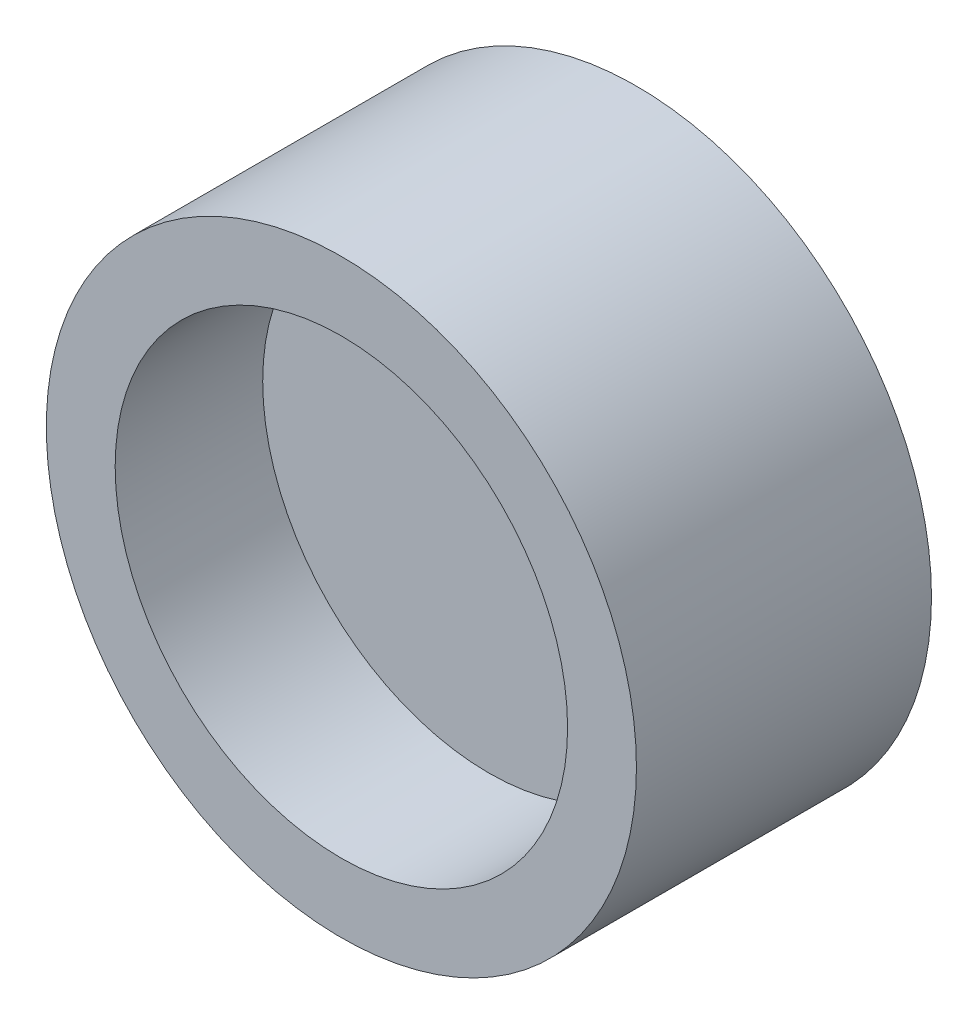
ISO-10303-21;
HEADER;
FILE_DESCRIPTION(('STEP AP214'),'2;1');
FILE_NAME('part.step','',(''),(''),'','','');
FILE_SCHEMA(('AUTOMOTIVE_DESIGN { 1 0 10303 214 1 1 1 1 }'));
ENDSEC;
DATA;
#1=APPLICATION_CONTEXT('core data for automotive mechanical design processes');
#2=APPLICATION_PROTOCOL_DEFINITION('international standard','automotive_design',2000,#1);
#3=PRODUCT_CONTEXT('',#1,'mechanical');
#4=PRODUCT('Part','Part','',(#3));
#5=PRODUCT_RELATED_PRODUCT_CATEGORY('part','',(#4));
#6=PRODUCT_DEFINITION_FORMATION('','',#4);
#7=PRODUCT_DEFINITION_CONTEXT('part definition',#1,'design');
#8=PRODUCT_DEFINITION('design','',#6,#7);
#9=PRODUCT_DEFINITION_SHAPE('','',#8);
#10=(LENGTH_UNIT() NAMED_UNIT(*) SI_UNIT(.MILLI.,.METRE.));
#11=(NAMED_UNIT(*) PLANE_ANGLE_UNIT() SI_UNIT($,.RADIAN.));
#12=(NAMED_UNIT(*) SI_UNIT($,.STERADIAN.) SOLID_ANGLE_UNIT());
#13=UNCERTAINTY_MEASURE_WITH_UNIT(LENGTH_MEASURE(1.E-05),#10,'distance_accuracy_value','');
#14=(GEOMETRIC_REPRESENTATION_CONTEXT(3) GLOBAL_UNCERTAINTY_ASSIGNED_CONTEXT((#13)) GLOBAL_UNIT_ASSIGNED_CONTEXT((#10,
#11,#12)) REPRESENTATION_CONTEXT('',''));
#15=CARTESIAN_POINT('',(0.,0.,0.));
#16=DIRECTION('',(0.,0.,1.));
#17=DIRECTION('',(1.,0.,0.));
#18=AXIS2_PLACEMENT_3D('',#15,#16,#17);
#19=CARTESIAN_POINT('',(0.,0.,3.));
#20=DIRECTION('',(0.,0.,-1.));
#21=DIRECTION('',(-1.,0.,0.));
#22=AXIS2_PLACEMENT_3D('',#19,#20,#21);
#23=CYLINDRICAL_SURFACE('',#22,3.);
#24=CARTESIAN_POINT('',(0.,0.,3.));
#25=DIRECTION('',(0.,0.,1.));
#26=DIRECTION('',(1.,0.,0.));
#27=AXIS2_PLACEMENT_3D('',#24,#25,#26);
#28=CIRCLE('',#27,3.);
#29=CARTESIAN_POINT('',(3.,0.,3.));
#30=VERTEX_POINT('',#29);
#31=EDGE_CURVE('E10',#30,#30,#28,.T.);
#32=ORIENTED_EDGE('',*,*,#31,.F.);
#33=EDGE_LOOP('',(#32));
#34=FACE_BOUND('',#33,.T.);
#35=CARTESIAN_POINT('',(0.,0.,0.));
#36=DIRECTION('',(0.,0.,1.));
#37=DIRECTION('',(1.,0.,0.));
#38=AXIS2_PLACEMENT_3D('',#35,#36,#37);
#39=CIRCLE('',#38,3.);
#40=CARTESIAN_POINT('',(3.,0.,0.));
#41=VERTEX_POINT('',#40);
#42=EDGE_CURVE('E40',#41,#41,#39,.T.);
#43=ORIENTED_EDGE('',*,*,#42,.T.);
#44=EDGE_LOOP('',(#43));
#45=FACE_BOUND('',#44,.T.);
#46=ADVANCED_FACE('F37',(#34,#45),#23,.T.);
#47=CARTESIAN_POINT('',(0.,0.,3.));
#48=DIRECTION('',(0.,0.,1.));
#49=DIRECTION('',(1.,0.,0.));
#50=AXIS2_PLACEMENT_3D('',#47,#48,#49);
#51=PLANE('',#50);
#52=CARTESIAN_POINT('',(0.,0.,3.));
#53=DIRECTION('',(0.,0.,1.));
#54=DIRECTION('',(1.,0.,0.));
#55=AXIS2_PLACEMENT_3D('',#52,#53,#54);
#56=CIRCLE('',#55,2.3);
#57=CARTESIAN_POINT('',(2.3,0.,3.));
#58=VERTEX_POINT('',#57);
#59=EDGE_CURVE('E49',#58,#58,#56,.T.);
#60=ORIENTED_EDGE('',*,*,#59,.F.);
#61=EDGE_LOOP('',(#60));
#62=FACE_BOUND('',#61,.T.);
#63=ORIENTED_EDGE('',*,*,#31,.T.);
#64=EDGE_LOOP('',(#63));
#65=FACE_BOUND('',#64,.T.);
#66=ADVANCED_FACE('F64',(#62,#65),#51,.T.);
#67=CARTESIAN_POINT('',(0.,0.,0.));
#68=DIRECTION('',(0.,0.,1.));
#69=DIRECTION('',(1.,0.,0.));
#70=AXIS2_PLACEMENT_3D('',#67,#68,#69);
#71=PLANE('',#70);
#72=ORIENTED_EDGE('',*,*,#42,.F.);
#73=EDGE_LOOP('',(#72));
#74=FACE_BOUND('',#73,.T.);
#75=ADVANCED_FACE('F60',(#74),#71,.F.);
#76=CARTESIAN_POINT('',(0.,0.,1.5));
#77=DIRECTION('',(0.,0.,1.));
#78=DIRECTION('',(1.,0.,0.));
#79=AXIS2_PLACEMENT_3D('',#76,#77,#78);
#80=CYLINDRICAL_SURFACE('',#79,2.3);
#81=CARTESIAN_POINT('',(0.,0.,1.5));
#82=DIRECTION('',(0.,0.,1.));
#83=DIRECTION('',(1.,0.,0.));
#84=AXIS2_PLACEMENT_3D('',#81,#82,#83);
#85=CIRCLE('',#84,2.3);
#86=CARTESIAN_POINT('',(2.3,0.,1.5));
#87=VERTEX_POINT('',#86);
#88=EDGE_CURVE('E47',#87,#87,#85,.T.);
#89=ORIENTED_EDGE('',*,*,#88,.F.);
#90=EDGE_LOOP('',(#89));
#91=FACE_BOUND('',#90,.T.);
#92=ORIENTED_EDGE('',*,*,#59,.T.);
#93=EDGE_LOOP('',(#92));
#94=FACE_BOUND('',#93,.T.);
#95=ADVANCED_FACE('F57',(#91,#94),#80,.F.);
#96=CARTESIAN_POINT('',(0.,0.,1.5));
#97=DIRECTION('',(0.,0.,1.));
#98=DIRECTION('',(1.,0.,0.));
#99=AXIS2_PLACEMENT_3D('',#96,#97,#98);
#100=PLANE('',#99);
#101=ORIENTED_EDGE('',*,*,#88,.T.);
#102=EDGE_LOOP('',(#101));
#103=FACE_BOUND('',#102,.T.);
#104=ADVANCED_FACE('F55',(#103),#100,.T.);
#105=CLOSED_SHELL('',(#46,#66,#75,#95,#104));
#106=MANIFOLD_SOLID_BREP('B2',#105);
#107=ADVANCED_BREP_SHAPE_REPRESENTATION('',(#18,#106),#14);
#108=SHAPE_DEFINITION_REPRESENTATION(#9,#107);
ENDSEC;
END-ISO-10303-21;
